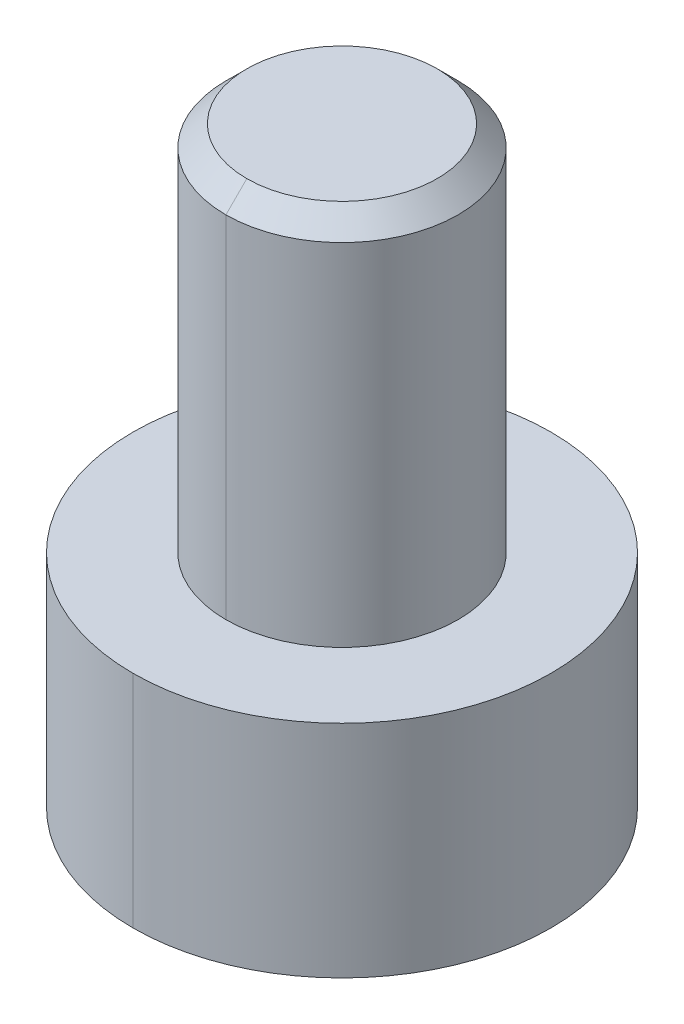
ISO-10303-21;
HEADER;
FILE_DESCRIPTION(('STEP AP214'),'2;1');
FILE_NAME('part.step','',(''),(''),'','','');
FILE_SCHEMA(('AUTOMOTIVE_DESIGN { 1 0 10303 214 1 1 1 1 }'));
ENDSEC;
DATA;
#1=APPLICATION_CONTEXT('core data for automotive mechanical design processes');
#2=APPLICATION_PROTOCOL_DEFINITION('international standard','automotive_design',2000,#1);
#3=PRODUCT_CONTEXT('',#1,'mechanical');
#4=PRODUCT('Part','Part','',(#3));
#5=PRODUCT_RELATED_PRODUCT_CATEGORY('part','',(#4));
#6=PRODUCT_DEFINITION_FORMATION('','',#4);
#7=PRODUCT_DEFINITION_CONTEXT('part definition',#1,'design');
#8=PRODUCT_DEFINITION('design','',#6,#7);
#9=PRODUCT_DEFINITION_SHAPE('','',#8);
#10=(LENGTH_UNIT() NAMED_UNIT(*) SI_UNIT(.MILLI.,.METRE.));
#11=(NAMED_UNIT(*) PLANE_ANGLE_UNIT() SI_UNIT($,.RADIAN.));
#12=(NAMED_UNIT(*) SI_UNIT($,.STERADIAN.) SOLID_ANGLE_UNIT());
#13=UNCERTAINTY_MEASURE_WITH_UNIT(LENGTH_MEASURE(1.E-05),#10,'distance_accuracy_value','');
#14=(GEOMETRIC_REPRESENTATION_CONTEXT(3) GLOBAL_UNCERTAINTY_ASSIGNED_CONTEXT((#13)) GLOBAL_UNIT_ASSIGNED_CONTEXT((#10,
#11,#12)) REPRESENTATION_CONTEXT('',''));
#15=CARTESIAN_POINT('',(0.,0.,0.));
#16=DIRECTION('',(0.,0.,1.));
#17=DIRECTION('',(1.,0.,0.));
#18=AXIS2_PLACEMENT_3D('',#15,#16,#17);
#19=CARTESIAN_POINT('',(0.,-1.25,0.));
#20=DIRECTION('',(0.,-1.,0.));
#21=DIRECTION('',(0.,0.,-1.));
#22=AXIS2_PLACEMENT_3D('',#19,#20,#21);
#23=PLANE('',#22);
#24=DIRECTION('',(-0.866025403784429,0.,0.500000000000017));
#25=VECTOR('',#24,1.);
#26=CARTESIAN_POINT('',(1.,-1.25,0.5773502691896));
#27=LINE('',#26,#25);
#28=CARTESIAN_POINT('',(1.,-1.25,0.5773502691896));
#29=VERTEX_POINT('',#28);
#30=CARTESIAN_POINT('',(0.,-1.25,1.15470053837905));
#31=VERTEX_POINT('',#30);
#32=EDGE_CURVE('E204',#29,#31,#27,.T.);
#33=ORIENTED_EDGE('',*,*,#32,.T.);
#34=DIRECTION('',(-0.866025403784429,0.,-0.500000000000017));
#35=VECTOR('',#34,1.);
#36=CARTESIAN_POINT('',(0.,-1.25,1.154700538379));
#37=LINE('',#36,#35);
#38=CARTESIAN_POINT('',(-0.999999999999945,-1.25,0.577350269189506));
#39=VERTEX_POINT('',#38);
#40=EDGE_CURVE('E11',#31,#39,#37,.T.);
#41=ORIENTED_EDGE('',*,*,#40,.T.);
#42=DIRECTION('',(0.,0.,-1.));
#43=VECTOR('',#42,1.);
#44=CARTESIAN_POINT('',(-1.,-1.25,0.5773502691896));
#45=LINE('',#44,#43);
#46=CARTESIAN_POINT('',(-1.,-1.25,-0.5773502691896));
#47=VERTEX_POINT('',#46);
#48=EDGE_CURVE('E187',#39,#47,#45,.T.);
#49=ORIENTED_EDGE('',*,*,#48,.T.);
#50=DIRECTION('',(0.866025403784429,0.,-0.500000000000017));
#51=VECTOR('',#50,1.);
#52=CARTESIAN_POINT('',(-1.,-1.25,-0.5773502691896));
#53=LINE('',#52,#51);
#54=CARTESIAN_POINT('',(0.,-1.25,-1.15470053837909));
#55=VERTEX_POINT('',#54);
#56=EDGE_CURVE('E170',#47,#55,#53,.T.);
#57=ORIENTED_EDGE('',*,*,#56,.T.);
#58=DIRECTION('',(0.866025403784429,0.,0.500000000000017));
#59=VECTOR('',#58,1.);
#60=CARTESIAN_POINT('',(0.,-1.25,-1.154700538379));
#61=LINE('',#60,#59);
#62=CARTESIAN_POINT('',(0.999999999999945,-1.25,-0.577350269189506));
#63=VERTEX_POINT('',#62);
#64=EDGE_CURVE('E284',#55,#63,#61,.T.);
#65=ORIENTED_EDGE('',*,*,#64,.T.);
#66=DIRECTION('',(0.,0.,1.));
#67=VECTOR('',#66,1.);
#68=CARTESIAN_POINT('',(1.,-1.25,-0.5773502691896));
#69=LINE('',#68,#67);
#70=EDGE_CURVE('E278',#63,#29,#69,.T.);
#71=ORIENTED_EDGE('',*,*,#70,.T.);
#72=EDGE_LOOP('',(#33,#41,#49,#57,#65,#71));
#73=FACE_BOUND('',#72,.T.);
#74=ADVANCED_FACE('F16',(#73),#23,.T.);
#75=CARTESIAN_POINT('',(0.,4.,0.));
#76=DIRECTION('',(0.,1.,0.));
#77=DIRECTION('',(1.,0.,0.));
#78=AXIS2_PLACEMENT_3D('',#75,#76,#77);
#79=PLANE('',#78);
#80=CARTESIAN_POINT('',(0.,4.00000000007595,0.));
#81=DIRECTION('',(0.,-1.,0.));
#82=DIRECTION('',(0.,0.,-1.));
#83=AXIS2_PLACEMENT_3D('',#80,#81,#82);
#84=CIRCLE('',#83,1.02500000002692);
#85=CARTESIAN_POINT('',(0.,4.00000000007595,-1.02500000002692));
#86=VERTEX_POINT('',#85);
#87=CARTESIAN_POINT('',(0.,4.00000000007595,1.02500000002692));
#88=VERTEX_POINT('',#87);
#89=EDGE_CURVE('E195',#86,#88,#84,.T.);
#90=ORIENTED_EDGE('',*,*,#89,.F.);
#91=CARTESIAN_POINT('',(0.,4.00000000007595,0.));
#92=DIRECTION('',(0.,-1.,0.));
#93=DIRECTION('',(0.,0.,-1.));
#94=AXIS2_PLACEMENT_3D('',#91,#92,#93);
#95=CIRCLE('',#94,1.02500000002692);
#96=EDGE_CURVE('E203',#88,#86,#95,.T.);
#97=ORIENTED_EDGE('',*,*,#96,.F.);
#98=EDGE_LOOP('',(#90,#97));
#99=FACE_BOUND('',#98,.T.);
#100=ADVANCED_FACE('F447',(#99),#79,.T.);
#101=CARTESIAN_POINT('',(0.,-2.5,1.154700538379));
#102=DIRECTION('',(-0.500000000000017,0.,0.866025403784429));
#103=DIRECTION('',(0.,1.,0.));
#104=AXIS2_PLACEMENT_3D('',#101,#102,#103);
#105=PLANE('',#104);
#106=ORIENTED_EDGE('',*,*,#40,.F.);
#107=DIRECTION('',(0.,-1.,0.));
#108=VECTOR('',#107,1.);
#109=CARTESIAN_POINT('',(1.08853898117545E-13,-2.5,1.15470053837919));
#110=LINE('',#109,#108);
#111=CARTESIAN_POINT('',(0.,-2.5,1.15470053837905));
#112=VERTEX_POINT('',#111);
#113=EDGE_CURVE('E254',#31,#112,#110,.T.);
#114=ORIENTED_EDGE('',*,*,#113,.T.);
#115=DIRECTION('',(-0.866025403784523,0.,-0.499999999999853));
#116=VECTOR('',#115,1.);
#117=CARTESIAN_POINT('',(0.,-2.5,1.154700538379));
#118=LINE('',#117,#116);
#119=CARTESIAN_POINT('',(-0.999999999999945,-2.5,0.577350269189506));
#120=VERTEX_POINT('',#119);
#121=EDGE_CURVE('E183',#112,#120,#118,.T.);
#122=ORIENTED_EDGE('',*,*,#121,.T.);
#123=DIRECTION('',(0.,1.,0.));
#124=VECTOR('',#123,1.);
#125=CARTESIAN_POINT('',(-1.,-2.5,0.5773502691896));
#126=LINE('',#125,#124);
#127=EDGE_CURVE('E27',#120,#39,#126,.T.);
#128=ORIENTED_EDGE('',*,*,#127,.T.);
#129=EDGE_LOOP('',(#106,#114,#122,#128));
#130=FACE_BOUND('',#129,.T.);
#131=ADVANCED_FACE('F293',(#130),#105,.F.);
#132=CARTESIAN_POINT('',(-1.,-2.5,0.5773502691896));
#133=DIRECTION('',(-1.,0.,0.));
#134=DIRECTION('',(0.,0.,1.));
#135=AXIS2_PLACEMENT_3D('',#132,#133,#134);
#136=PLANE('',#135);
#137=ORIENTED_EDGE('',*,*,#48,.F.);
#138=ORIENTED_EDGE('',*,*,#127,.F.);
#139=DIRECTION('',(0.,0.,-1.));
#140=VECTOR('',#139,1.);
#141=CARTESIAN_POINT('',(-1.,-2.5,0.));
#142=LINE('',#141,#140);
#143=CARTESIAN_POINT('',(-1.,-2.5,-0.5773502691896));
#144=VERTEX_POINT('',#143);
#145=EDGE_CURVE('E179',#120,#144,#142,.T.);
#146=ORIENTED_EDGE('',*,*,#145,.T.);
#147=DIRECTION('',(0.,1.,0.));
#148=VECTOR('',#147,1.);
#149=CARTESIAN_POINT('',(-1.,-2.5,-0.5773502691896));
#150=LINE('',#149,#148);
#151=EDGE_CURVE('E172',#144,#47,#150,.T.);
#152=ORIENTED_EDGE('',*,*,#151,.T.);
#153=EDGE_LOOP('',(#137,#138,#146,#152));
#154=FACE_BOUND('',#153,.T.);
#155=ADVANCED_FACE('F303',(#154),#136,.F.);
#156=CARTESIAN_POINT('',(-1.,-2.5,-0.5773502691896));
#157=DIRECTION('',(-0.500000000000017,0.,-0.866025403784429));
#158=DIRECTION('',(-0.866025403784429,0.,0.500000000000017));
#159=AXIS2_PLACEMENT_3D('',#156,#157,#158);
#160=PLANE('',#159);
#161=ORIENTED_EDGE('',*,*,#56,.F.);
#162=ORIENTED_EDGE('',*,*,#151,.F.);
#163=DIRECTION('',(0.866025403784523,0.,-0.499999999999853));
#164=VECTOR('',#163,1.);
#165=CARTESIAN_POINT('',(-1.,-2.5,-0.5773502691896));
#166=LINE('',#165,#164);
#167=CARTESIAN_POINT('',(0.,-2.5,-1.15470053837909));
#168=VERTEX_POINT('',#167);
#169=EDGE_CURVE('E184',#144,#168,#166,.T.);
#170=ORIENTED_EDGE('',*,*,#169,.T.);
#171=DIRECTION('',(0.,1.,0.));
#172=VECTOR('',#171,1.);
#173=CARTESIAN_POINT('',(0.,-2.5,-1.154700538379));
#174=LINE('',#173,#172);
#175=EDGE_CURVE('E169',#168,#55,#174,.T.);
#176=ORIENTED_EDGE('',*,*,#175,.T.);
#177=EDGE_LOOP('',(#161,#162,#170,#176));
#178=FACE_BOUND('',#177,.T.);
#179=ADVANCED_FACE('F18',(#178),#160,.F.);
#180=CARTESIAN_POINT('',(0.,-2.5,-1.154700538379));
#181=DIRECTION('',(0.500000000000017,0.,-0.866025403784429));
#182=DIRECTION('',(0.,-1.,0.));
#183=AXIS2_PLACEMENT_3D('',#180,#181,#182);
#184=PLANE('',#183);
#185=ORIENTED_EDGE('',*,*,#64,.F.);
#186=ORIENTED_EDGE('',*,*,#175,.F.);
#187=DIRECTION('',(0.866025403784523,0.,0.499999999999853));
#188=VECTOR('',#187,1.);
#189=CARTESIAN_POINT('',(0.,-2.5,-1.154700538379));
#190=LINE('',#189,#188);
#191=CARTESIAN_POINT('',(0.999999999999945,-2.5,-0.577350269189506));
#192=VERTEX_POINT('',#191);
#193=EDGE_CURVE('E250',#168,#192,#190,.T.);
#194=ORIENTED_EDGE('',*,*,#193,.T.);
#195=DIRECTION('',(0.,1.,0.));
#196=VECTOR('',#195,1.);
#197=CARTESIAN_POINT('',(1.,-2.5,-0.5773502691896));
#198=LINE('',#197,#196);
#199=EDGE_CURVE('E281',#192,#63,#198,.T.);
#200=ORIENTED_EDGE('',*,*,#199,.T.);
#201=EDGE_LOOP('',(#185,#186,#194,#200));
#202=FACE_BOUND('',#201,.T.);
#203=ADVANCED_FACE('F309',(#202),#184,.F.);
#204=CARTESIAN_POINT('',(1.,-2.5,-0.5773502691896));
#205=DIRECTION('',(1.,0.,0.));
#206=DIRECTION('',(0.,1.,0.));
#207=AXIS2_PLACEMENT_3D('',#204,#205,#206);
#208=PLANE('',#207);
#209=ORIENTED_EDGE('',*,*,#70,.F.);
#210=ORIENTED_EDGE('',*,*,#199,.F.);
#211=DIRECTION('',(0.,0.,1.));
#212=VECTOR('',#211,1.);
#213=CARTESIAN_POINT('',(1.,-2.5,0.));
#214=LINE('',#213,#212);
#215=CARTESIAN_POINT('',(1.,-2.5,0.5773502691896));
#216=VERTEX_POINT('',#215);
#217=EDGE_CURVE('E242',#192,#216,#214,.T.);
#218=ORIENTED_EDGE('',*,*,#217,.T.);
#219=DIRECTION('',(0.,1.,0.));
#220=VECTOR('',#219,1.);
#221=CARTESIAN_POINT('',(1.,-2.5,0.5773502691896));
#222=LINE('',#221,#220);
#223=EDGE_CURVE('E207',#216,#29,#222,.T.);
#224=ORIENTED_EDGE('',*,*,#223,.T.);
#225=EDGE_LOOP('',(#209,#210,#218,#224));
#226=FACE_BOUND('',#225,.T.);
#227=ADVANCED_FACE('F439',(#226),#208,.F.);
#228=CARTESIAN_POINT('',(1.,-2.5,0.5773502691896));
#229=DIRECTION('',(0.500000000000017,0.,0.866025403784429));
#230=DIRECTION('',(0.,-1.,0.));
#231=AXIS2_PLACEMENT_3D('',#228,#229,#230);
#232=PLANE('',#231);
#233=ORIENTED_EDGE('',*,*,#32,.F.);
#234=ORIENTED_EDGE('',*,*,#223,.F.);
#235=DIRECTION('',(-0.866025403784523,0.,0.499999999999853));
#236=VECTOR('',#235,1.);
#237=CARTESIAN_POINT('',(1.,-2.5,0.5773502691896));
#238=LINE('',#237,#236);
#239=EDGE_CURVE('E199',#216,#112,#238,.T.);
#240=ORIENTED_EDGE('',*,*,#239,.T.);
#241=ORIENTED_EDGE('',*,*,#113,.F.);
#242=EDGE_LOOP('',(#233,#234,#240,#241));
#243=FACE_BOUND('',#242,.T.);
#244=ADVANCED_FACE('F478',(#243),#232,.F.);
#245=CARTESIAN_POINT('',(0.,3.77500000024611,0.));
#246=DIRECTION('',(0.,-1.,0.));
#247=DIRECTION('',(0.,0.,-1.));
#248=AXIS2_PLACEMENT_3D('',#245,#246,#247);
#249=CONICAL_SURFACE('',#248,1.24999999985675,0.785398163397448);
#250=DIRECTION('',(0.,-0.707106781186548,0.707106781186548));
#251=VECTOR('',#250,1.);
#252=CARTESIAN_POINT('',(0.,3.77500000024611,1.24999999985675));
#253=LINE('',#252,#251);
#254=CARTESIAN_POINT('',(0.,3.77500000001,1.25000000009286));
#255=VERTEX_POINT('',#254);
#256=EDGE_CURVE('E190',#88,#255,#253,.T.);
#257=ORIENTED_EDGE('',*,*,#256,.F.);
#258=ORIENTED_EDGE('',*,*,#96,.T.);
#259=DIRECTION('',(0.,-0.707106781186548,-0.707106781186548));
#260=VECTOR('',#259,1.);
#261=CARTESIAN_POINT('',(0.,3.77500000024611,-1.24999999985675));
#262=LINE('',#261,#260);
#263=CARTESIAN_POINT('',(0.,3.77500000001,-1.25000000009286));
#264=VERTEX_POINT('',#263);
#265=EDGE_CURVE('E194',#86,#264,#262,.T.);
#266=ORIENTED_EDGE('',*,*,#265,.T.);
#267=CARTESIAN_POINT('',(0.,3.77500000001,0.));
#268=DIRECTION('',(0.,-1.,0.));
#269=DIRECTION('',(0.,0.,1.));
#270=AXIS2_PLACEMENT_3D('',#267,#268,#269);
#271=CIRCLE('',#270,1.25);
#272=EDGE_CURVE('E143',#255,#264,#271,.T.);
#273=ORIENTED_EDGE('',*,*,#272,.F.);
#274=EDGE_LOOP('',(#257,#258,#266,#273));
#275=FACE_BOUND('',#274,.T.);
#276=ADVANCED_FACE('F229',(#275),#249,.T.);
#277=CARTESIAN_POINT('',(0.,-2.5,0.));
#278=DIRECTION('',(0.,1.,0.));
#279=DIRECTION('',(1.,0.,0.));
#280=AXIS2_PLACEMENT_3D('',#277,#278,#279);
#281=PLANE('',#280);
#282=ORIENTED_EDGE('',*,*,#217,.F.);
#283=ORIENTED_EDGE('',*,*,#193,.F.);
#284=ORIENTED_EDGE('',*,*,#169,.F.);
#285=ORIENTED_EDGE('',*,*,#145,.F.);
#286=ORIENTED_EDGE('',*,*,#121,.F.);
#287=ORIENTED_EDGE('',*,*,#239,.F.);
#288=EDGE_LOOP('',(#282,#283,#284,#285,#286,#287));
#289=FACE_BOUND('',#288,.T.);
#290=CARTESIAN_POINT('',(0.,-2.49999999993209,0.));
#291=DIRECTION('',(0.,1.,0.));
#292=DIRECTION('',(0.,0.,1.));
#293=AXIS2_PLACEMENT_3D('',#290,#291,#292);
#294=CIRCLE('',#293,2.03349364903716);
#295=CARTESIAN_POINT('',(0.,-2.49999999993209,2.03349364903716));
#296=VERTEX_POINT('',#295);
#297=CARTESIAN_POINT('',(0.,-2.49999999993209,-2.03349364903716));
#298=VERTEX_POINT('',#297);
#299=EDGE_CURVE('E141',#296,#298,#294,.T.);
#300=ORIENTED_EDGE('',*,*,#299,.F.);
#301=CARTESIAN_POINT('',(0.,-2.49999999993209,0.));
#302=DIRECTION('',(0.,1.,0.));
#303=DIRECTION('',(0.,0.,1.));
#304=AXIS2_PLACEMENT_3D('',#301,#302,#303);
#305=CIRCLE('',#304,2.03349364903716);
#306=EDGE_CURVE('E131',#298,#296,#305,.T.);
#307=ORIENTED_EDGE('',*,*,#306,.F.);
#308=EDGE_LOOP('',(#300,#307));
#309=FACE_BOUND('',#308,.T.);
#310=ADVANCED_FACE('F139',(#289,#309),#281,.F.);
#311=CARTESIAN_POINT('',(0.,-2.825,0.));
#312=DIRECTION('',(0.,1.,0.));
#313=DIRECTION('',(0.,0.,1.));
#314=AXIS2_PLACEMENT_3D('',#311,#312,#313);
#315=CYLINDRICAL_SURFACE('',#314,1.25);
#316=DIRECTION('',(0.,1.,0.));
#317=VECTOR('',#316,1.);
#318=CARTESIAN_POINT('',(0.,-2.825,-1.25));
#319=LINE('',#318,#317);
#320=CARTESIAN_POINT('',(0.,0.,-1.25));
#321=VERTEX_POINT('',#320);
#322=EDGE_CURVE('E178',#321,#264,#319,.T.);
#323=ORIENTED_EDGE('',*,*,#322,.F.);
#324=CARTESIAN_POINT('',(0.,0.,0.));
#325=DIRECTION('',(0.,-1.,0.));
#326=DIRECTION('',(0.,0.,1.));
#327=AXIS2_PLACEMENT_3D('',#324,#325,#326);
#328=CIRCLE('',#327,1.25);
#329=CARTESIAN_POINT('',(0.,0.,1.25));
#330=VERTEX_POINT('',#329);
#331=EDGE_CURVE('E144',#330,#321,#328,.T.);
#332=ORIENTED_EDGE('',*,*,#331,.F.);
#333=DIRECTION('',(0.,1.,0.));
#334=VECTOR('',#333,1.);
#335=CARTESIAN_POINT('',(0.,-2.825,1.25));
#336=LINE('',#335,#334);
#337=EDGE_CURVE('E177',#330,#255,#336,.T.);
#338=ORIENTED_EDGE('',*,*,#337,.T.);
#339=ORIENTED_EDGE('',*,*,#272,.T.);
#340=EDGE_LOOP('',(#323,#332,#338,#339));
#341=FACE_BOUND('',#340,.T.);
#342=ADVANCED_FACE('F240',(#341),#315,.T.);
#343=CARTESIAN_POINT('',(0.,-2.37499999997226,0.));
#344=DIRECTION('',(0.,1.,0.));
#345=DIRECTION('',(0.,0.,1.));
#346=AXIS2_PLACEMENT_3D('',#343,#344,#345);
#347=CONICAL_SURFACE('',#346,2.24999999988995,1.04719755114913);
#348=DIRECTION('',(0.,0.500000000041109,-0.866025403760704));
#349=VECTOR('',#348,1.);
#350=CARTESIAN_POINT('',(0.,-2.37499999997226,-2.24999999988995));
#351=LINE('',#350,#349);
#352=CARTESIAN_POINT('',(0.,-2.37500000001,-2.24999999982459));
#353=VERTEX_POINT('',#352);
#354=EDGE_CURVE('E146',#298,#353,#351,.T.);
#355=ORIENTED_EDGE('',*,*,#354,.F.);
#356=ORIENTED_EDGE('',*,*,#306,.T.);
#357=DIRECTION('',(0.,0.500000000041109,0.866025403760704));
#358=VECTOR('',#357,1.);
#359=CARTESIAN_POINT('',(0.,-2.37499999997226,2.24999999988995));
#360=LINE('',#359,#358);
#361=CARTESIAN_POINT('',(0.,-2.37500000001,2.24999999982459));
#362=VERTEX_POINT('',#361);
#363=EDGE_CURVE('E153',#296,#362,#360,.T.);
#364=ORIENTED_EDGE('',*,*,#363,.T.);
#365=CARTESIAN_POINT('',(0.,-2.37500000001,0.));
#366=DIRECTION('',(0.,1.,0.));
#367=DIRECTION('',(0.,0.,1.));
#368=AXIS2_PLACEMENT_3D('',#365,#366,#367);
#369=CIRCLE('',#368,2.25);
#370=EDGE_CURVE('E148',#353,#362,#369,.T.);
#371=ORIENTED_EDGE('',*,*,#370,.F.);
#372=EDGE_LOOP('',(#355,#356,#364,#371));
#373=FACE_BOUND('',#372,.T.);
#374=ADVANCED_FACE('F147',(#373),#347,.T.);
#375=CARTESIAN_POINT('',(0.,0.,0.));
#376=DIRECTION('',(0.,1.,0.));
#377=DIRECTION('',(1.,0.,0.));
#378=AXIS2_PLACEMENT_3D('',#375,#376,#377);
#379=PLANE('',#378);
#380=ORIENTED_EDGE('',*,*,#331,.T.);
#381=CARTESIAN_POINT('',(0.,0.,0.));
#382=DIRECTION('',(0.,-1.,0.));
#383=DIRECTION('',(0.,0.,1.));
#384=AXIS2_PLACEMENT_3D('',#381,#382,#383);
#385=CIRCLE('',#384,1.25);
#386=EDGE_CURVE('E20',#321,#330,#385,.T.);
#387=ORIENTED_EDGE('',*,*,#386,.T.);
#388=EDGE_LOOP('',(#380,#387));
#389=FACE_BOUND('',#388,.T.);
#390=CARTESIAN_POINT('',(0.,0.,0.));
#391=DIRECTION('',(0.,-1.,0.));
#392=DIRECTION('',(0.,0.,1.));
#393=AXIS2_PLACEMENT_3D('',#390,#391,#392);
#394=CIRCLE('',#393,2.25);
#395=CARTESIAN_POINT('',(0.,0.,2.25));
#396=VERTEX_POINT('',#395);
#397=CARTESIAN_POINT('',(0.,0.,-2.25));
#398=VERTEX_POINT('',#397);
#399=EDGE_CURVE('E196',#396,#398,#394,.T.);
#400=ORIENTED_EDGE('',*,*,#399,.F.);
#401=CARTESIAN_POINT('',(0.,0.,0.));
#402=DIRECTION('',(0.,-1.,0.));
#403=DIRECTION('',(0.,0.,1.));
#404=AXIS2_PLACEMENT_3D('',#401,#402,#403);
#405=CIRCLE('',#404,2.25);
#406=EDGE_CURVE('E165',#398,#396,#405,.T.);
#407=ORIENTED_EDGE('',*,*,#406,.F.);
#408=EDGE_LOOP('',(#400,#407));
#409=FACE_BOUND('',#408,.T.);
#410=ADVANCED_FACE('F491',(#389,#409),#379,.T.);
#411=CARTESIAN_POINT('',(0.,-2.825,0.));
#412=DIRECTION('',(0.,1.,0.));
#413=DIRECTION('',(0.,0.,1.));
#414=AXIS2_PLACEMENT_3D('',#411,#412,#413);
#415=CYLINDRICAL_SURFACE('',#414,2.25);
#416=DIRECTION('',(0.,1.,0.));
#417=VECTOR('',#416,1.);
#418=CARTESIAN_POINT('',(0.,-2.825,-2.25));
#419=LINE('',#418,#417);
#420=EDGE_CURVE('E257',#353,#398,#419,.T.);
#421=ORIENTED_EDGE('',*,*,#420,.F.);
#422=ORIENTED_EDGE('',*,*,#370,.T.);
#423=DIRECTION('',(0.,1.,0.));
#424=VECTOR('',#423,1.);
#425=CARTESIAN_POINT('',(0.,-2.825,2.25));
#426=LINE('',#425,#424);
#427=EDGE_CURVE('E157',#362,#396,#426,.T.);
#428=ORIENTED_EDGE('',*,*,#427,.T.);
#429=ORIENTED_EDGE('',*,*,#399,.T.);
#430=EDGE_LOOP('',(#421,#422,#428,#429));
#431=FACE_BOUND('',#430,.T.);
#432=ADVANCED_FACE('F470',(#431),#415,.T.);
#433=CARTESIAN_POINT('',(0.,3.77500000024611,0.));
#434=DIRECTION('',(0.,-1.,0.));
#435=DIRECTION('',(0.,0.,-1.));
#436=AXIS2_PLACEMENT_3D('',#433,#434,#435);
#437=CONICAL_SURFACE('',#436,1.24999999985675,0.785398163397448);
#438=ORIENTED_EDGE('',*,*,#89,.T.);
#439=ORIENTED_EDGE('',*,*,#256,.T.);
#440=CARTESIAN_POINT('',(0.,3.77500000001,0.));
#441=DIRECTION('',(0.,-1.,0.));
#442=DIRECTION('',(0.,0.,1.));
#443=AXIS2_PLACEMENT_3D('',#440,#441,#442);
#444=CIRCLE('',#443,1.25);
#445=EDGE_CURVE('E173',#264,#255,#444,.T.);
#446=ORIENTED_EDGE('',*,*,#445,.F.);
#447=ORIENTED_EDGE('',*,*,#265,.F.);
#448=EDGE_LOOP('',(#438,#439,#446,#447));
#449=FACE_BOUND('',#448,.T.);
#450=ADVANCED_FACE('F232',(#449),#437,.T.);
#451=CARTESIAN_POINT('',(0.,-2.825,0.));
#452=DIRECTION('',(0.,1.,0.));
#453=DIRECTION('',(0.,0.,1.));
#454=AXIS2_PLACEMENT_3D('',#451,#452,#453);
#455=CYLINDRICAL_SURFACE('',#454,1.25);
#456=ORIENTED_EDGE('',*,*,#386,.F.);
#457=ORIENTED_EDGE('',*,*,#322,.T.);
#458=ORIENTED_EDGE('',*,*,#445,.T.);
#459=ORIENTED_EDGE('',*,*,#337,.F.);
#460=EDGE_LOOP('',(#456,#457,#458,#459));
#461=FACE_BOUND('',#460,.T.);
#462=ADVANCED_FACE('F237',(#461),#455,.T.);
#463=CARTESIAN_POINT('',(0.,-2.37499999997226,0.));
#464=DIRECTION('',(0.,1.,0.));
#465=DIRECTION('',(0.,0.,1.));
#466=AXIS2_PLACEMENT_3D('',#463,#464,#465);
#467=CONICAL_SURFACE('',#466,2.24999999988995,1.04719755114913);
#468=ORIENTED_EDGE('',*,*,#299,.T.);
#469=ORIENTED_EDGE('',*,*,#354,.T.);
#470=CARTESIAN_POINT('',(0.,-2.37500000001,0.));
#471=DIRECTION('',(0.,1.,0.));
#472=DIRECTION('',(0.,0.,1.));
#473=AXIS2_PLACEMENT_3D('',#470,#471,#472);
#474=CIRCLE('',#473,2.25);
#475=EDGE_CURVE('E261',#362,#353,#474,.T.);
#476=ORIENTED_EDGE('',*,*,#475,.F.);
#477=ORIENTED_EDGE('',*,*,#363,.F.);
#478=EDGE_LOOP('',(#468,#469,#476,#477));
#479=FACE_BOUND('',#478,.T.);
#480=ADVANCED_FACE('F155',(#479),#467,.T.);
#481=CARTESIAN_POINT('',(0.,-2.825,0.));
#482=DIRECTION('',(0.,1.,0.));
#483=DIRECTION('',(0.,0.,1.));
#484=AXIS2_PLACEMENT_3D('',#481,#482,#483);
#485=CYLINDRICAL_SURFACE('',#484,2.25);
#486=ORIENTED_EDGE('',*,*,#475,.T.);
#487=ORIENTED_EDGE('',*,*,#420,.T.);
#488=ORIENTED_EDGE('',*,*,#406,.T.);
#489=ORIENTED_EDGE('',*,*,#427,.F.);
#490=EDGE_LOOP('',(#486,#487,#488,#489));
#491=FACE_BOUND('',#490,.T.);
#492=ADVANCED_FACE('F486',(#491),#485,.T.);
#493=CLOSED_SHELL('',(#74,#100,#131,#155,#179,#203,#227,#244,#276,#310,#342,#374,#410,#432,#450,
#462,#480,#492));
#494=MANIFOLD_SOLID_BREP('B1',#493);
#495=ADVANCED_BREP_SHAPE_REPRESENTATION('',(#18,#494),#14);
#496=SHAPE_DEFINITION_REPRESENTATION(#9,#495);
ENDSEC;
END-ISO-10303-21;
